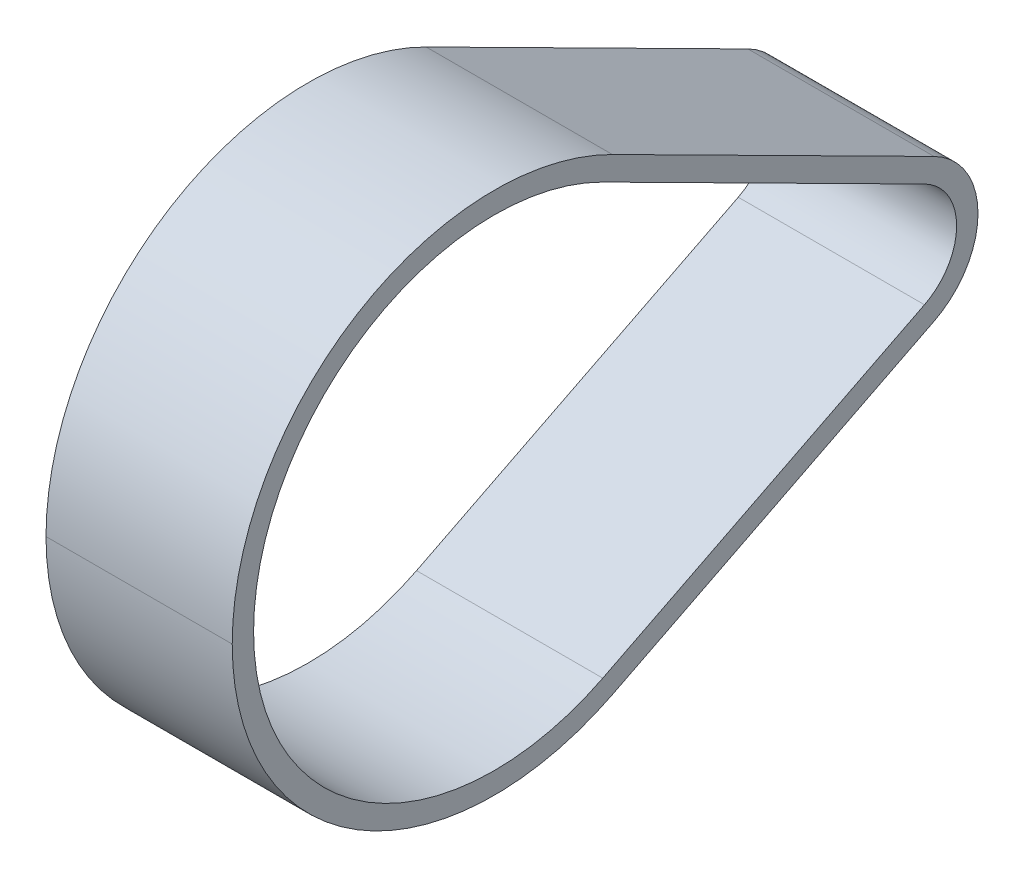
ISO-10303-21;
HEADER;
FILE_DESCRIPTION(('STEP AP214'),'2;1');
FILE_NAME('part.step','',(''),(''),'','','');
FILE_SCHEMA(('AUTOMOTIVE_DESIGN { 1 0 10303 214 1 1 1 1 }'));
ENDSEC;
DATA;
#1=APPLICATION_CONTEXT('core data for automotive mechanical design processes');
#2=APPLICATION_PROTOCOL_DEFINITION('international standard','automotive_design',2000,#1);
#3=PRODUCT_CONTEXT('',#1,'mechanical');
#4=PRODUCT('Part','Part','',(#3));
#5=PRODUCT_RELATED_PRODUCT_CATEGORY('part','',(#4));
#6=PRODUCT_DEFINITION_FORMATION('','',#4);
#7=PRODUCT_DEFINITION_CONTEXT('part definition',#1,'design');
#8=PRODUCT_DEFINITION('design','',#6,#7);
#9=PRODUCT_DEFINITION_SHAPE('','',#8);
#10=(LENGTH_UNIT() NAMED_UNIT(*) SI_UNIT(.MILLI.,.METRE.));
#11=(NAMED_UNIT(*) PLANE_ANGLE_UNIT() SI_UNIT($,.RADIAN.));
#12=(NAMED_UNIT(*) SI_UNIT($,.STERADIAN.) SOLID_ANGLE_UNIT());
#13=UNCERTAINTY_MEASURE_WITH_UNIT(LENGTH_MEASURE(1.E-05),#10,'distance_accuracy_value','');
#14=(GEOMETRIC_REPRESENTATION_CONTEXT(3) GLOBAL_UNCERTAINTY_ASSIGNED_CONTEXT((#13)) GLOBAL_UNIT_ASSIGNED_CONTEXT((#10,
#11,#12)) REPRESENTATION_CONTEXT('',''));
#15=CARTESIAN_POINT('',(0.,0.,0.));
#16=DIRECTION('',(0.,0.,1.));
#17=DIRECTION('',(1.,0.,0.));
#18=AXIS2_PLACEMENT_3D('',#15,#16,#17);
#19=CARTESIAN_POINT('',(10.5,0.,0.));
#20=DIRECTION('',(-1.,0.,0.));
#21=DIRECTION('',(0.,0.,1.));
#22=AXIS2_PLACEMENT_3D('',#19,#20,#21);
#23=CYLINDRICAL_SURFACE('',#22,27.14);
#24=CARTESIAN_POINT('',(10.5,0.,0.));
#25=DIRECTION('',(1.,0.,0.));
#26=DIRECTION('',(0.,0.,-1.));
#27=AXIS2_PLACEMENT_3D('',#24,#25,#26);
#28=CIRCLE('',#27,27.14);
#29=CARTESIAN_POINT('',(10.5,24.2241659155091,-12.2380303030303));
#30=VERTEX_POINT('',#29);
#31=CARTESIAN_POINT('',(10.5,0.,27.14));
#32=VERTEX_POINT('',#31);
#33=EDGE_CURVE('E11',#30,#32,#28,.T.);
#34=ORIENTED_EDGE('',*,*,#33,.T.);
#35=DIRECTION('',(-1.,0.,0.));
#36=VECTOR('',#35,1.);
#37=CARTESIAN_POINT('',(10.5,0.,27.14));
#38=LINE('',#37,#36);
#39=CARTESIAN_POINT('',(-10.5,0.,27.14));
#40=VERTEX_POINT('',#39);
#41=EDGE_CURVE('E27',#32,#40,#38,.T.);
#42=ORIENTED_EDGE('',*,*,#41,.T.);
#43=CARTESIAN_POINT('',(-10.5,0.,0.));
#44=DIRECTION('',(1.,0.,0.));
#45=DIRECTION('',(0.,0.,-1.));
#46=AXIS2_PLACEMENT_3D('',#43,#44,#45);
#47=CIRCLE('',#46,27.14);
#48=CARTESIAN_POINT('',(-10.5,24.2241659155091,-12.2380303030303));
#49=VERTEX_POINT('',#48);
#50=EDGE_CURVE('E176',#49,#40,#47,.T.);
#51=ORIENTED_EDGE('',*,*,#50,.F.);
#52=DIRECTION('',(-1.,0.,0.));
#53=VECTOR('',#52,1.);
#54=CARTESIAN_POINT('',(10.5,24.2241659155091,-12.2380303030303));
#55=LINE('',#54,#53);
#56=EDGE_CURVE('E199',#30,#49,#55,.T.);
#57=ORIENTED_EDGE('',*,*,#56,.F.);
#58=EDGE_LOOP('',(#34,#42,#51,#57));
#59=FACE_BOUND('',#58,.T.);
#60=ADVANCED_FACE('F16',(#59),#23,.F.);
#61=CARTESIAN_POINT('',(10.5,0.,0.));
#62=DIRECTION('',(-1.,0.,0.));
#63=DIRECTION('',(0.,0.,1.));
#64=AXIS2_PLACEMENT_3D('',#61,#62,#63);
#65=CYLINDRICAL_SURFACE('',#64,29.55);
#66=CARTESIAN_POINT('',(10.5,0.,0.));
#67=DIRECTION('',(1.,0.,0.));
#68=DIRECTION('',(0.,0.,-1.));
#69=AXIS2_PLACEMENT_3D('',#66,#67,#68);
#70=CIRCLE('',#69,29.55);
#71=CARTESIAN_POINT('',(10.5,0.,29.55));
#72=VERTEX_POINT('',#71);
#73=CARTESIAN_POINT('',(10.5,-26.3752432867831,-13.3247529644269));
#74=VERTEX_POINT('',#73);
#75=EDGE_CURVE('E125',#72,#74,#70,.T.);
#76=ORIENTED_EDGE('',*,*,#75,.F.);
#77=DIRECTION('',(-1.,0.,0.));
#78=VECTOR('',#77,1.);
#79=CARTESIAN_POINT('',(10.5,0.,29.55));
#80=LINE('',#79,#78);
#81=CARTESIAN_POINT('',(-10.5,0.,29.55));
#82=VERTEX_POINT('',#81);
#83=EDGE_CURVE('E185',#72,#82,#80,.T.);
#84=ORIENTED_EDGE('',*,*,#83,.T.);
#85=CARTESIAN_POINT('',(-10.5,0.,0.));
#86=DIRECTION('',(1.,0.,0.));
#87=DIRECTION('',(0.,0.,-1.));
#88=AXIS2_PLACEMENT_3D('',#85,#86,#87);
#89=CIRCLE('',#88,29.55);
#90=CARTESIAN_POINT('',(-10.5,-26.3752432867831,-13.3247529644269));
#91=VERTEX_POINT('',#90);
#92=EDGE_CURVE('E127',#82,#91,#89,.T.);
#93=ORIENTED_EDGE('',*,*,#92,.T.);
#94=DIRECTION('',(-1.,0.,0.));
#95=VECTOR('',#94,1.);
#96=CARTESIAN_POINT('',(10.5,-26.3752432867831,-13.3247529644269));
#97=LINE('',#96,#95);
#98=EDGE_CURVE('E116',#74,#91,#97,.T.);
#99=ORIENTED_EDGE('',*,*,#98,.F.);
#100=EDGE_LOOP('',(#76,#84,#93,#99));
#101=FACE_BOUND('',#100,.T.);
#102=ADVANCED_FACE('F123',(#101),#65,.T.);
#103=CARTESIAN_POINT('',(10.5,0.,0.));
#104=DIRECTION('',(1.,0.,0.));
#105=DIRECTION('',(0.,1.,0.));
#106=AXIS2_PLACEMENT_3D('',#103,#104,#105);
#107=PLANE('',#106);
#108=CARTESIAN_POINT('',(10.5,0.,0.));
#109=DIRECTION('',(1.,0.,0.));
#110=DIRECTION('',(0.,0.,-1.));
#111=AXIS2_PLACEMENT_3D('',#108,#109,#110);
#112=CIRCLE('',#111,29.55);
#113=CARTESIAN_POINT('',(10.5,26.3752432867831,-13.3247529644269));
#114=VERTEX_POINT('',#113);
#115=EDGE_CURVE('E141',#114,#72,#112,.T.);
#116=ORIENTED_EDGE('',*,*,#115,.T.);
#117=ORIENTED_EDGE('',*,*,#75,.T.);
#118=DIRECTION('',(0.,0.450922266139658,-0.892563224595029));
#119=VECTOR('',#118,1.);
#120=CARTESIAN_POINT('',(10.5,-26.3752432867831,-13.3247529644269));
#121=LINE('',#120,#119);
#122=CARTESIAN_POINT('',(10.5,-8.04645746972419,-49.605064229249));
#123=VERTEX_POINT('',#122);
#124=EDGE_CURVE('E138',#74,#123,#121,.T.);
#125=ORIENTED_EDGE('',*,*,#124,.T.);
#126=CARTESIAN_POINT('',(10.5,0.,-45.54));
#127=DIRECTION('',(1.,0.,0.));
#128=DIRECTION('',(0.,0.,1.));
#129=AXIS2_PLACEMENT_3D('',#126,#127,#128);
#130=CIRCLE('',#129,9.015);
#131=CARTESIAN_POINT('',(10.5,8.04645746972419,-49.605064229249));
#132=VERTEX_POINT('',#131);
#133=EDGE_CURVE('E148',#123,#132,#130,.T.);
#134=ORIENTED_EDGE('',*,*,#133,.T.);
#135=DIRECTION('',(0.,0.450922266139658,0.892563224595029));
#136=VECTOR('',#135,1.);
#137=CARTESIAN_POINT('',(10.5,26.3752432867831,-13.3247529644269));
#138=LINE('',#137,#136);
#139=EDGE_CURVE('E154',#132,#114,#138,.T.);
#140=ORIENTED_EDGE('',*,*,#139,.T.);
#141=EDGE_LOOP('',(#116,#117,#125,#134,#140));
#142=FACE_BOUND('',#141,.T.);
#143=DIRECTION('',(0.,0.450922266139657,-0.892563224595029));
#144=VECTOR('',#143,1.);
#145=CARTESIAN_POINT('',(10.5,-24.2241659155091,-12.2380303030303));
#146=LINE('',#145,#144);
#147=CARTESIAN_POINT('',(10.5,-24.2241659155091,-12.2380303030303));
#148=VERTEX_POINT('',#147);
#149=CARTESIAN_POINT('',(10.5,-5.89538009845017,-48.5183415678525));
#150=VERTEX_POINT('',#149);
#151=EDGE_CURVE('E92',#148,#150,#146,.T.);
#152=ORIENTED_EDGE('',*,*,#151,.F.);
#153=CARTESIAN_POINT('',(10.5,0.,0.));
#154=DIRECTION('',(1.,0.,0.));
#155=DIRECTION('',(0.,0.,-1.));
#156=AXIS2_PLACEMENT_3D('',#153,#154,#155);
#157=CIRCLE('',#156,27.14);
#158=EDGE_CURVE('E160',#32,#148,#157,.T.);
#159=ORIENTED_EDGE('',*,*,#158,.F.);
#160=ORIENTED_EDGE('',*,*,#33,.F.);
#161=DIRECTION('',(0.,0.450922266139658,0.892563224595029));
#162=VECTOR('',#161,1.);
#163=CARTESIAN_POINT('',(10.5,24.2241659155091,-12.2380303030303));
#164=LINE('',#163,#162);
#165=CARTESIAN_POINT('',(10.5,5.89538009845017,-48.5183415678524));
#166=VERTEX_POINT('',#165);
#167=EDGE_CURVE('E80',#166,#30,#164,.T.);
#168=ORIENTED_EDGE('',*,*,#167,.F.);
#169=CARTESIAN_POINT('',(10.5,0.,-45.54));
#170=DIRECTION('',(1.,0.,0.));
#171=DIRECTION('',(0.,0.,1.));
#172=AXIS2_PLACEMENT_3D('',#169,#170,#171);
#173=CIRCLE('',#172,6.605);
#174=EDGE_CURVE('E191',#150,#166,#173,.T.);
#175=ORIENTED_EDGE('',*,*,#174,.F.);
#176=EDGE_LOOP('',(#152,#159,#160,#168,#175));
#177=FACE_BOUND('',#176,.T.);
#178=ADVANCED_FACE('F136',(#142,#177),#107,.T.);
#179=CARTESIAN_POINT('',(-10.5,0.,0.));
#180=DIRECTION('',(1.,0.,0.));
#181=DIRECTION('',(0.,1.,0.));
#182=AXIS2_PLACEMENT_3D('',#179,#180,#181);
#183=PLANE('',#182);
#184=CARTESIAN_POINT('',(-10.5,0.,0.));
#185=DIRECTION('',(1.,0.,0.));
#186=DIRECTION('',(0.,0.,-1.));
#187=AXIS2_PLACEMENT_3D('',#184,#185,#186);
#188=CIRCLE('',#187,29.55);
#189=CARTESIAN_POINT('',(-10.5,26.3752432867831,-13.3247529644269));
#190=VERTEX_POINT('',#189);
#191=EDGE_CURVE('E182',#190,#82,#188,.T.);
#192=ORIENTED_EDGE('',*,*,#191,.F.);
#193=DIRECTION('',(0.,0.450922266139658,0.892563224595029));
#194=VECTOR('',#193,1.);
#195=CARTESIAN_POINT('',(-10.5,26.3752432867831,-13.3247529644269));
#196=LINE('',#195,#194);
#197=CARTESIAN_POINT('',(-10.5,8.04645746972419,-49.605064229249));
#198=VERTEX_POINT('',#197);
#199=EDGE_CURVE('E167',#198,#190,#196,.T.);
#200=ORIENTED_EDGE('',*,*,#199,.F.);
#201=CARTESIAN_POINT('',(-10.5,0.,-45.54));
#202=DIRECTION('',(1.,0.,0.));
#203=DIRECTION('',(0.,0.,1.));
#204=AXIS2_PLACEMENT_3D('',#201,#202,#203);
#205=CIRCLE('',#204,9.015);
#206=CARTESIAN_POINT('',(-10.5,-8.04645746972419,-49.605064229249));
#207=VERTEX_POINT('',#206);
#208=EDGE_CURVE('E131',#207,#198,#205,.T.);
#209=ORIENTED_EDGE('',*,*,#208,.F.);
#210=DIRECTION('',(0.,0.450922266139658,-0.892563224595029));
#211=VECTOR('',#210,1.);
#212=CARTESIAN_POINT('',(-10.5,-26.3752432867831,-13.3247529644269));
#213=LINE('',#212,#211);
#214=EDGE_CURVE('E130',#91,#207,#213,.T.);
#215=ORIENTED_EDGE('',*,*,#214,.F.);
#216=ORIENTED_EDGE('',*,*,#92,.F.);
#217=EDGE_LOOP('',(#192,#200,#209,#215,#216));
#218=FACE_BOUND('',#217,.T.);
#219=ORIENTED_EDGE('',*,*,#50,.T.);
#220=CARTESIAN_POINT('',(-10.5,0.,0.));
#221=DIRECTION('',(1.,0.,0.));
#222=DIRECTION('',(0.,0.,-1.));
#223=AXIS2_PLACEMENT_3D('',#220,#221,#222);
#224=CIRCLE('',#223,27.14);
#225=CARTESIAN_POINT('',(-10.5,-24.2241659155091,-12.2380303030303));
#226=VERTEX_POINT('',#225);
#227=EDGE_CURVE('E174',#40,#226,#224,.T.);
#228=ORIENTED_EDGE('',*,*,#227,.T.);
#229=DIRECTION('',(0.,0.450922266139657,-0.892563224595029));
#230=VECTOR('',#229,1.);
#231=CARTESIAN_POINT('',(-10.5,-24.2241659155091,-12.2380303030303));
#232=LINE('',#231,#230);
#233=CARTESIAN_POINT('',(-10.5,-5.89538009845017,-48.5183415678525));
#234=VERTEX_POINT('',#233);
#235=EDGE_CURVE('E165',#226,#234,#232,.T.);
#236=ORIENTED_EDGE('',*,*,#235,.T.);
#237=CARTESIAN_POINT('',(-10.5,0.,-45.54));
#238=DIRECTION('',(1.,0.,0.));
#239=DIRECTION('',(0.,0.,1.));
#240=AXIS2_PLACEMENT_3D('',#237,#238,#239);
#241=CIRCLE('',#240,6.605);
#242=CARTESIAN_POINT('',(-10.5,5.89538009845017,-48.5183415678524));
#243=VERTEX_POINT('',#242);
#244=EDGE_CURVE('E161',#234,#243,#241,.T.);
#245=ORIENTED_EDGE('',*,*,#244,.T.);
#246=DIRECTION('',(0.,0.450922266139658,0.892563224595029));
#247=VECTOR('',#246,1.);
#248=CARTESIAN_POINT('',(-10.5,24.2241659155091,-12.2380303030303));
#249=LINE('',#248,#247);
#250=EDGE_CURVE('E166',#243,#49,#249,.T.);
#251=ORIENTED_EDGE('',*,*,#250,.T.);
#252=EDGE_LOOP('',(#219,#228,#236,#245,#251));
#253=FACE_BOUND('',#252,.T.);
#254=ADVANCED_FACE('F261',(#218,#253),#183,.F.);
#255=CARTESIAN_POINT('',(10.5,0.,0.));
#256=DIRECTION('',(-1.,0.,0.));
#257=DIRECTION('',(0.,0.,1.));
#258=AXIS2_PLACEMENT_3D('',#255,#256,#257);
#259=CYLINDRICAL_SURFACE('',#258,29.55);
#260=ORIENTED_EDGE('',*,*,#83,.F.);
#261=ORIENTED_EDGE('',*,*,#115,.F.);
#262=DIRECTION('',(-1.,0.,0.));
#263=VECTOR('',#262,1.);
#264=CARTESIAN_POINT('',(10.5,26.3752432867831,-13.3247529644269));
#265=LINE('',#264,#263);
#266=EDGE_CURVE('E178',#114,#190,#265,.T.);
#267=ORIENTED_EDGE('',*,*,#266,.T.);
#268=ORIENTED_EDGE('',*,*,#191,.T.);
#269=EDGE_LOOP('',(#260,#261,#267,#268));
#270=FACE_BOUND('',#269,.T.);
#271=ADVANCED_FACE('F335',(#270),#259,.T.);
#272=CARTESIAN_POINT('',(10.5,-26.3752432867831,-13.3247529644269));
#273=DIRECTION('',(0.,0.892563224595029,0.450922266139658));
#274=DIRECTION('',(1.,0.,0.));
#275=AXIS2_PLACEMENT_3D('',#272,#273,#274);
#276=PLANE('',#275);
#277=ORIENTED_EDGE('',*,*,#214,.T.);
#278=DIRECTION('',(-1.,0.,0.));
#279=VECTOR('',#278,1.);
#280=CARTESIAN_POINT('',(10.5,-8.04645746972419,-49.605064229249));
#281=LINE('',#280,#279);
#282=EDGE_CURVE('E146',#123,#207,#281,.T.);
#283=ORIENTED_EDGE('',*,*,#282,.F.);
#284=ORIENTED_EDGE('',*,*,#124,.F.);
#285=ORIENTED_EDGE('',*,*,#98,.T.);
#286=EDGE_LOOP('',(#277,#283,#284,#285));
#287=FACE_BOUND('',#286,.T.);
#288=ADVANCED_FACE('F144',(#287),#276,.F.);
#289=CARTESIAN_POINT('',(10.5,0.,-45.54));
#290=DIRECTION('',(-1.,0.,0.));
#291=DIRECTION('',(0.,0.,1.));
#292=AXIS2_PLACEMENT_3D('',#289,#290,#291);
#293=CYLINDRICAL_SURFACE('',#292,9.015);
#294=ORIENTED_EDGE('',*,*,#208,.T.);
#295=DIRECTION('',(-1.,0.,0.));
#296=VECTOR('',#295,1.);
#297=CARTESIAN_POINT('',(10.5,8.04645746972419,-49.605064229249));
#298=LINE('',#297,#296);
#299=EDGE_CURVE('E170',#132,#198,#298,.T.);
#300=ORIENTED_EDGE('',*,*,#299,.F.);
#301=ORIENTED_EDGE('',*,*,#133,.F.);
#302=ORIENTED_EDGE('',*,*,#282,.T.);
#303=EDGE_LOOP('',(#294,#300,#301,#302));
#304=FACE_BOUND('',#303,.T.);
#305=ADVANCED_FACE('F232',(#304),#293,.T.);
#306=CARTESIAN_POINT('',(10.5,26.3752432867831,-13.3247529644269));
#307=DIRECTION('',(0.,-0.892563224595029,0.450922266139658));
#308=DIRECTION('',(-1.,0.,0.));
#309=AXIS2_PLACEMENT_3D('',#306,#307,#308);
#310=PLANE('',#309);
#311=ORIENTED_EDGE('',*,*,#199,.T.);
#312=ORIENTED_EDGE('',*,*,#266,.F.);
#313=ORIENTED_EDGE('',*,*,#139,.F.);
#314=ORIENTED_EDGE('',*,*,#299,.T.);
#315=EDGE_LOOP('',(#311,#312,#313,#314));
#316=FACE_BOUND('',#315,.T.);
#317=ADVANCED_FACE('F278',(#316),#310,.F.);
#318=CARTESIAN_POINT('',(10.5,0.,0.));
#319=DIRECTION('',(-1.,0.,0.));
#320=DIRECTION('',(0.,0.,1.));
#321=AXIS2_PLACEMENT_3D('',#318,#319,#320);
#322=CYLINDRICAL_SURFACE('',#321,27.14);
#323=ORIENTED_EDGE('',*,*,#41,.F.);
#324=ORIENTED_EDGE('',*,*,#158,.T.);
#325=DIRECTION('',(-1.,0.,0.));
#326=VECTOR('',#325,1.);
#327=CARTESIAN_POINT('',(10.5,-24.2241659155091,-12.2380303030303));
#328=LINE('',#327,#326);
#329=EDGE_CURVE('E157',#148,#226,#328,.T.);
#330=ORIENTED_EDGE('',*,*,#329,.T.);
#331=ORIENTED_EDGE('',*,*,#227,.F.);
#332=EDGE_LOOP('',(#323,#324,#330,#331));
#333=FACE_BOUND('',#332,.T.);
#334=ADVANCED_FACE('F273',(#333),#322,.F.);
#335=CARTESIAN_POINT('',(10.5,-24.2241659155091,-12.2380303030303));
#336=DIRECTION('',(0.,0.892563224595029,0.450922266139657));
#337=DIRECTION('',(1.,0.,0.));
#338=AXIS2_PLACEMENT_3D('',#335,#336,#337);
#339=PLANE('',#338);
#340=ORIENTED_EDGE('',*,*,#235,.F.);
#341=ORIENTED_EDGE('',*,*,#329,.F.);
#342=ORIENTED_EDGE('',*,*,#151,.T.);
#343=DIRECTION('',(-1.,0.,0.));
#344=VECTOR('',#343,1.);
#345=CARTESIAN_POINT('',(10.5,-5.89538009845017,-48.5183415678525));
#346=LINE('',#345,#344);
#347=EDGE_CURVE('E20',#150,#234,#346,.T.);
#348=ORIENTED_EDGE('',*,*,#347,.T.);
#349=EDGE_LOOP('',(#340,#341,#342,#348));
#350=FACE_BOUND('',#349,.T.);
#351=ADVANCED_FACE('F264',(#350),#339,.T.);
#352=CARTESIAN_POINT('',(10.5,0.,-45.54));
#353=DIRECTION('',(-1.,0.,0.));
#354=DIRECTION('',(0.,0.,1.));
#355=AXIS2_PLACEMENT_3D('',#352,#353,#354);
#356=CYLINDRICAL_SURFACE('',#355,6.605);
#357=ORIENTED_EDGE('',*,*,#244,.F.);
#358=ORIENTED_EDGE('',*,*,#347,.F.);
#359=ORIENTED_EDGE('',*,*,#174,.T.);
#360=DIRECTION('',(-1.,0.,0.));
#361=VECTOR('',#360,1.);
#362=CARTESIAN_POINT('',(10.5,5.89538009845017,-48.5183415678524));
#363=LINE('',#362,#361);
#364=EDGE_CURVE('E194',#166,#243,#363,.T.);
#365=ORIENTED_EDGE('',*,*,#364,.T.);
#366=EDGE_LOOP('',(#357,#358,#359,#365));
#367=FACE_BOUND('',#366,.T.);
#368=ADVANCED_FACE('F258',(#367),#356,.F.);
#369=CARTESIAN_POINT('',(10.5,24.2241659155091,-12.2380303030303));
#370=DIRECTION('',(0.,-0.892563224595029,0.450922266139658));
#371=DIRECTION('',(-1.,0.,0.));
#372=AXIS2_PLACEMENT_3D('',#369,#370,#371);
#373=PLANE('',#372);
#374=ORIENTED_EDGE('',*,*,#250,.F.);
#375=ORIENTED_EDGE('',*,*,#364,.F.);
#376=ORIENTED_EDGE('',*,*,#167,.T.);
#377=ORIENTED_EDGE('',*,*,#56,.T.);
#378=EDGE_LOOP('',(#374,#375,#376,#377));
#379=FACE_BOUND('',#378,.T.);
#380=ADVANCED_FACE('F18',(#379),#373,.T.);
#381=CLOSED_SHELL('',(#60,#102,#178,#254,#271,#288,#305,#317,#334,#351,#368,#380));
#382=MANIFOLD_SOLID_BREP('B1',#381);
#383=ADVANCED_BREP_SHAPE_REPRESENTATION('',(#18,#382),#14);
#384=SHAPE_DEFINITION_REPRESENTATION(#9,#383);
ENDSEC;
END-ISO-10303-21;
